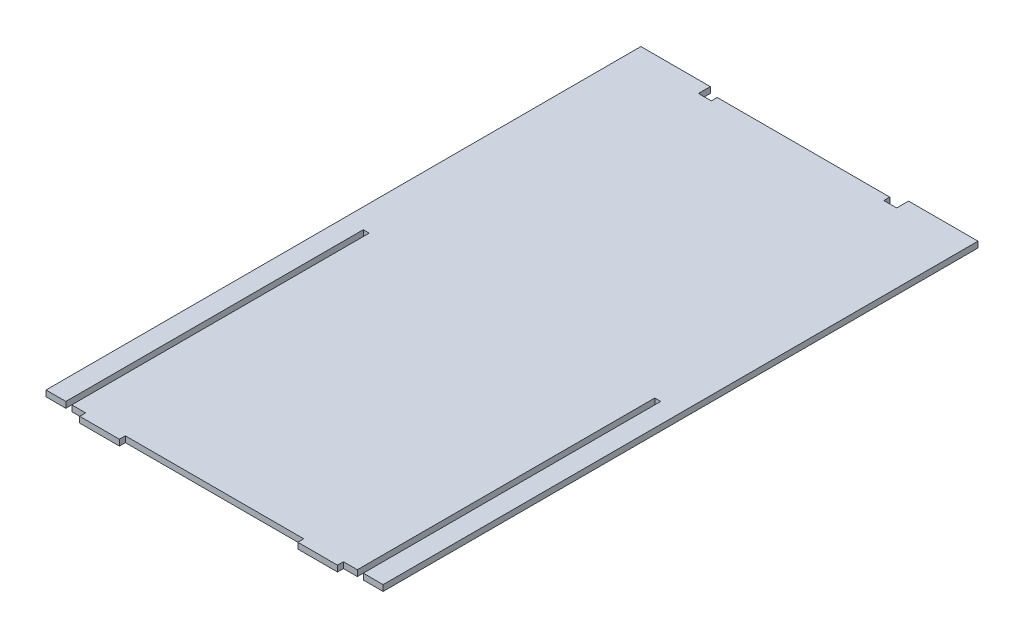
ISO-10303-21;
HEADER;
FILE_DESCRIPTION(('STEP AP214'),'2;1');
FILE_NAME('part.step','',(''),(''),'','','');
FILE_SCHEMA(('AUTOMOTIVE_DESIGN { 1 0 10303 214 1 1 1 1 }'));
ENDSEC;
DATA;
#1=APPLICATION_CONTEXT('core data for automotive mechanical design processes');
#2=APPLICATION_PROTOCOL_DEFINITION('international standard','automotive_design',2000,#1);
#3=PRODUCT_CONTEXT('',#1,'mechanical');
#4=PRODUCT('Part','Part','',(#3));
#5=PRODUCT_RELATED_PRODUCT_CATEGORY('part','',(#4));
#6=PRODUCT_DEFINITION_FORMATION('','',#4);
#7=PRODUCT_DEFINITION_CONTEXT('part definition',#1,'design');
#8=PRODUCT_DEFINITION('design','',#6,#7);
#9=PRODUCT_DEFINITION_SHAPE('','',#8);
#10=(LENGTH_UNIT() NAMED_UNIT(*) SI_UNIT(.MILLI.,.METRE.));
#11=(NAMED_UNIT(*) PLANE_ANGLE_UNIT() SI_UNIT($,.RADIAN.));
#12=(NAMED_UNIT(*) SI_UNIT($,.STERADIAN.) SOLID_ANGLE_UNIT());
#13=UNCERTAINTY_MEASURE_WITH_UNIT(LENGTH_MEASURE(1.E-05),#10,'distance_accuracy_value','');
#14=(GEOMETRIC_REPRESENTATION_CONTEXT(3) GLOBAL_UNCERTAINTY_ASSIGNED_CONTEXT((#13)) GLOBAL_UNIT_ASSIGNED_CONTEXT((#10,
#11,#12)) REPRESENTATION_CONTEXT('',''));
#15=CARTESIAN_POINT('',(0.,0.,0.));
#16=DIRECTION('',(0.,0.,1.));
#17=DIRECTION('',(1.,0.,0.));
#18=AXIS2_PLACEMENT_3D('',#15,#16,#17);
#19=CARTESIAN_POINT('',(0.,6.,-600.));
#20=DIRECTION('',(0.,0.,1.));
#21=DIRECTION('',(1.,0.,0.));
#22=AXIS2_PLACEMENT_3D('',#19,#20,#21);
#23=PLANE('',#22);
#24=DIRECTION('',(-1.,0.,0.));
#25=VECTOR('',#24,1.);
#26=CARTESIAN_POINT('',(0.,6.,-600.));
#27=LINE('',#26,#25);
#28=CARTESIAN_POINT('',(70.,6.,-600.));
#29=VERTEX_POINT('',#28);
#30=CARTESIAN_POINT('',(0.,6.,-600.));
#31=VERTEX_POINT('',#30);
#32=EDGE_CURVE('E366',#29,#31,#27,.T.);
#33=ORIENTED_EDGE('',*,*,#32,.F.);
#34=DIRECTION('',(0.,1.,0.));
#35=VECTOR('',#34,1.);
#36=CARTESIAN_POINT('',(70.,0.,-600.));
#37=LINE('',#36,#35);
#38=CARTESIAN_POINT('',(70.,0.,-600.));
#39=VERTEX_POINT('',#38);
#40=EDGE_CURVE('E282',#39,#29,#37,.T.);
#41=ORIENTED_EDGE('',*,*,#40,.F.);
#42=DIRECTION('',(-1.,0.,0.));
#43=VECTOR('',#42,1.);
#44=CARTESIAN_POINT('',(0.,0.,-600.));
#45=LINE('',#44,#43);
#46=CARTESIAN_POINT('',(0.,0.,-600.));
#47=VERTEX_POINT('',#46);
#48=EDGE_CURVE('E396',#39,#47,#45,.T.);
#49=ORIENTED_EDGE('',*,*,#48,.T.);
#50=DIRECTION('',(0.,-1.,0.));
#51=VECTOR('',#50,1.);
#52=CARTESIAN_POINT('',(0.,6.,-600.));
#53=LINE('',#52,#51);
#54=EDGE_CURVE('E404',#31,#47,#53,.T.);
#55=ORIENTED_EDGE('',*,*,#54,.F.);
#56=EDGE_LOOP('',(#33,#41,#49,#55));
#57=FACE_BOUND('',#56,.T.);
#58=ADVANCED_FACE('F41',(#57),#23,.F.);
#59=CARTESIAN_POINT('',(300.,6.,-2.10463319099841E-13));
#60=DIRECTION('',(0.,0.,-1.));
#61=DIRECTION('',(-1.,0.,0.));
#62=AXIS2_PLACEMENT_3D('',#59,#60,#61);
#63=PLANE('',#62);
#64=DIRECTION('',(1.,0.,0.));
#65=VECTOR('',#64,1.);
#66=CARTESIAN_POINT('',(300.,0.,-2.10463319099841E-13));
#67=LINE('',#66,#65);
#68=CARTESIAN_POINT('',(300.,0.,-2.10463319099841E-13));
#69=VERTEX_POINT('',#68);
#70=CARTESIAN_POINT('',(314.,0.,-3.31505656259168E-13));
#71=VERTEX_POINT('',#70);
#72=EDGE_CURVE('E391',#69,#71,#67,.T.);
#73=ORIENTED_EDGE('',*,*,#72,.T.);
#74=DIRECTION('',(0.,1.,0.));
#75=VECTOR('',#74,1.);
#76=CARTESIAN_POINT('',(314.,0.,-3.31505656259168E-13));
#77=LINE('',#76,#75);
#78=CARTESIAN_POINT('',(314.,6.,-3.31505656259168E-13));
#79=VERTEX_POINT('',#78);
#80=EDGE_CURVE('E300',#71,#79,#77,.T.);
#81=ORIENTED_EDGE('',*,*,#80,.T.);
#82=DIRECTION('',(1.,0.,0.));
#83=VECTOR('',#82,1.);
#84=CARTESIAN_POINT('',(300.,6.,-2.10463319099841E-13));
#85=LINE('',#84,#83);
#86=CARTESIAN_POINT('',(300.,6.,-2.10463319099841E-13));
#87=VERTEX_POINT('',#86);
#88=EDGE_CURVE('E361',#87,#79,#85,.T.);
#89=ORIENTED_EDGE('',*,*,#88,.F.);
#90=DIRECTION('',(0.,-1.,0.));
#91=VECTOR('',#90,1.);
#92=CARTESIAN_POINT('',(300.,6.,-2.10463319099841E-13));
#93=LINE('',#92,#91);
#94=EDGE_CURVE('E413',#87,#69,#93,.T.);
#95=ORIENTED_EDGE('',*,*,#94,.T.);
#96=EDGE_LOOP('',(#73,#81,#89,#95));
#97=FACE_BOUND('',#96,.T.);
#98=ADVANCED_FACE('F503',(#97),#63,.F.);
#99=CARTESIAN_POINT('',(40.,6.,0.));
#100=DIRECTION('',(0.,0.,-1.));
#101=DIRECTION('',(-1.,0.,0.));
#102=AXIS2_PLACEMENT_3D('',#99,#100,#101);
#103=PLANE('',#102);
#104=DIRECTION('',(1.,0.,0.));
#105=VECTOR('',#104,1.);
#106=CARTESIAN_POINT('',(40.,0.,0.));
#107=LINE('',#106,#105);
#108=CARTESIAN_POINT('',(0.,0.,0.));
#109=VERTEX_POINT('',#108);
#110=CARTESIAN_POINT('',(20.,0.,0.));
#111=VERTEX_POINT('',#110);
#112=EDGE_CURVE('E373',#109,#111,#107,.T.);
#113=ORIENTED_EDGE('',*,*,#112,.T.);
#114=DIRECTION('',(0.,1.,0.));
#115=VECTOR('',#114,1.);
#116=CARTESIAN_POINT('',(20.,0.,0.));
#117=LINE('',#116,#115);
#118=CARTESIAN_POINT('',(20.,6.,0.));
#119=VERTEX_POINT('',#118);
#120=EDGE_CURVE('E326',#111,#119,#117,.T.);
#121=ORIENTED_EDGE('',*,*,#120,.T.);
#122=DIRECTION('',(1.,0.,0.));
#123=VECTOR('',#122,1.);
#124=CARTESIAN_POINT('',(40.,6.,0.));
#125=LINE('',#124,#123);
#126=CARTESIAN_POINT('',(0.,6.,0.));
#127=VERTEX_POINT('',#126);
#128=EDGE_CURVE('E342',#127,#119,#125,.T.);
#129=ORIENTED_EDGE('',*,*,#128,.F.);
#130=DIRECTION('',(0.,-1.,0.));
#131=VECTOR('',#130,1.);
#132=CARTESIAN_POINT('',(0.,6.,0.));
#133=LINE('',#132,#131);
#134=EDGE_CURVE('E372',#127,#109,#133,.T.);
#135=ORIENTED_EDGE('',*,*,#134,.T.);
#136=EDGE_LOOP('',(#113,#121,#129,#135));
#137=FACE_BOUND('',#136,.T.);
#138=ADVANCED_FACE('F476',(#137),#103,.F.);
#139=CARTESIAN_POINT('',(26.,6.,0.));
#140=VERTEX_POINT('',#139);
#141=CARTESIAN_POINT('',(40.,6.,0.));
#142=VERTEX_POINT('',#141);
#143=EDGE_CURVE('E346',#140,#142,#125,.T.);
#144=ORIENTED_EDGE('',*,*,#143,.F.);
#145=DIRECTION('',(0.,1.,0.));
#146=VECTOR('',#145,1.);
#147=CARTESIAN_POINT('',(26.,0.,0.));
#148=LINE('',#147,#146);
#149=CARTESIAN_POINT('',(26.,0.,0.));
#150=VERTEX_POINT('',#149);
#151=EDGE_CURVE('E338',#150,#140,#148,.T.);
#152=ORIENTED_EDGE('',*,*,#151,.F.);
#153=CARTESIAN_POINT('',(40.,0.,0.));
#154=VERTEX_POINT('',#153);
#155=EDGE_CURVE('E335',#150,#154,#107,.T.);
#156=ORIENTED_EDGE('',*,*,#155,.T.);
#157=DIRECTION('',(0.,-1.,0.));
#158=VECTOR('',#157,1.);
#159=CARTESIAN_POINT('',(40.,6.,0.));
#160=LINE('',#159,#158);
#161=EDGE_CURVE('E11',#142,#154,#160,.T.);
#162=ORIENTED_EDGE('',*,*,#161,.F.);
#163=EDGE_LOOP('',(#144,#152,#156,#162));
#164=FACE_BOUND('',#163,.T.);
#165=ADVANCED_FACE('F43',(#164),#103,.F.);
#166=CARTESIAN_POINT('',(40.,6.,0.));
#167=DIRECTION('',(1.,0.,0.));
#168=DIRECTION('',(0.,0.,-1.));
#169=AXIS2_PLACEMENT_3D('',#166,#167,#168);
#170=PLANE('',#169);
#171=DIRECTION('',(0.,0.,1.));
#172=VECTOR('',#171,1.);
#173=CARTESIAN_POINT('',(40.,0.,0.));
#174=LINE('',#173,#172);
#175=CARTESIAN_POINT('',(40.,0.,6.00000000000003));
#176=VERTEX_POINT('',#175);
#177=EDGE_CURVE('E376',#154,#176,#174,.T.);
#178=ORIENTED_EDGE('',*,*,#177,.T.);
#179=DIRECTION('',(0.,-1.,0.));
#180=VECTOR('',#179,1.);
#181=CARTESIAN_POINT('',(40.,6.,6.00000000000003));
#182=LINE('',#181,#180);
#183=CARTESIAN_POINT('',(40.,6.,6.00000000000003));
#184=VERTEX_POINT('',#183);
#185=EDGE_CURVE('E49',#184,#176,#182,.T.);
#186=ORIENTED_EDGE('',*,*,#185,.F.);
#187=DIRECTION('',(0.,0.,1.));
#188=VECTOR('',#187,1.);
#189=CARTESIAN_POINT('',(40.,6.,0.));
#190=LINE('',#189,#188);
#191=EDGE_CURVE('E345',#142,#184,#190,.T.);
#192=ORIENTED_EDGE('',*,*,#191,.F.);
#193=ORIENTED_EDGE('',*,*,#161,.T.);
#194=EDGE_LOOP('',(#178,#186,#192,#193));
#195=FACE_BOUND('',#194,.T.);
#196=ADVANCED_FACE('F460',(#195),#170,.F.);
#197=CARTESIAN_POINT('',(40.,6.,6.00000000000003));
#198=DIRECTION('',(0.,0.,-1.));
#199=DIRECTION('',(-1.,0.,0.));
#200=AXIS2_PLACEMENT_3D('',#197,#198,#199);
#201=PLANE('',#200);
#202=DIRECTION('',(1.,0.,0.));
#203=VECTOR('',#202,1.);
#204=CARTESIAN_POINT('',(40.,0.,6.00000000000003));
#205=LINE('',#204,#203);
#206=CARTESIAN_POINT('',(80.,0.,5.99999999999993));
#207=VERTEX_POINT('',#206);
#208=EDGE_CURVE('E378',#176,#207,#205,.T.);
#209=ORIENTED_EDGE('',*,*,#208,.T.);
#210=DIRECTION('',(0.,-1.,0.));
#211=VECTOR('',#210,1.);
#212=CARTESIAN_POINT('',(80.,6.,5.99999999999993));
#213=LINE('',#212,#211);
#214=CARTESIAN_POINT('',(80.,6.,5.99999999999993));
#215=VERTEX_POINT('',#214);
#216=EDGE_CURVE('E428',#215,#207,#213,.T.);
#217=ORIENTED_EDGE('',*,*,#216,.F.);
#218=DIRECTION('',(1.,0.,0.));
#219=VECTOR('',#218,1.);
#220=CARTESIAN_POINT('',(40.,6.,6.00000000000003));
#221=LINE('',#220,#219);
#222=EDGE_CURVE('E348',#184,#215,#221,.T.);
#223=ORIENTED_EDGE('',*,*,#222,.F.);
#224=ORIENTED_EDGE('',*,*,#185,.T.);
#225=EDGE_LOOP('',(#209,#217,#223,#224));
#226=FACE_BOUND('',#225,.T.);
#227=ADVANCED_FACE('F435',(#226),#201,.F.);
#228=CARTESIAN_POINT('',(80.,6.,5.99999999999993));
#229=DIRECTION('',(-1.,0.,0.));
#230=DIRECTION('',(0.,0.,1.));
#231=AXIS2_PLACEMENT_3D('',#228,#229,#230);
#232=PLANE('',#231);
#233=DIRECTION('',(0.,0.,-1.));
#234=VECTOR('',#233,1.);
#235=CARTESIAN_POINT('',(80.,0.,5.99999999999993));
#236=LINE('',#235,#234);
#237=CARTESIAN_POINT('',(80.,0.,0.));
#238=VERTEX_POINT('',#237);
#239=EDGE_CURVE('E380',#207,#238,#236,.T.);
#240=ORIENTED_EDGE('',*,*,#239,.T.);
#241=DIRECTION('',(0.,-1.,0.));
#242=VECTOR('',#241,1.);
#243=CARTESIAN_POINT('',(80.,6.,0.));
#244=LINE('',#243,#242);
#245=CARTESIAN_POINT('',(80.,6.,0.));
#246=VERTEX_POINT('',#245);
#247=EDGE_CURVE('E425',#246,#238,#244,.T.);
#248=ORIENTED_EDGE('',*,*,#247,.F.);
#249=DIRECTION('',(0.,0.,-1.));
#250=VECTOR('',#249,1.);
#251=CARTESIAN_POINT('',(80.,6.,5.99999999999993));
#252=LINE('',#251,#250);
#253=EDGE_CURVE('E350',#215,#246,#252,.T.);
#254=ORIENTED_EDGE('',*,*,#253,.F.);
#255=ORIENTED_EDGE('',*,*,#216,.T.);
#256=EDGE_LOOP('',(#240,#248,#254,#255));
#257=FACE_BOUND('',#256,.T.);
#258=ADVANCED_FACE('F446',(#257),#232,.F.);
#259=CARTESIAN_POINT('',(80.,6.,0.));
#260=DIRECTION('',(0.,0.,-1.));
#261=DIRECTION('',(-1.,0.,0.));
#262=AXIS2_PLACEMENT_3D('',#259,#260,#261);
#263=PLANE('',#262);
#264=DIRECTION('',(1.,0.,0.));
#265=VECTOR('',#264,1.);
#266=CARTESIAN_POINT('',(80.,0.,0.));
#267=LINE('',#266,#265);
#268=CARTESIAN_POINT('',(260.,0.,-1.85615411929518E-13));
#269=VERTEX_POINT('',#268);
#270=EDGE_CURVE('E382',#238,#269,#267,.T.);
#271=ORIENTED_EDGE('',*,*,#270,.T.);
#272=DIRECTION('',(0.,-1.,0.));
#273=VECTOR('',#272,1.);
#274=CARTESIAN_POINT('',(260.,6.,-1.85615411929518E-13));
#275=LINE('',#274,#273);
#276=CARTESIAN_POINT('',(260.,6.,-1.85615411929518E-13));
#277=VERTEX_POINT('',#276);
#278=EDGE_CURVE('E422',#277,#269,#275,.T.);
#279=ORIENTED_EDGE('',*,*,#278,.F.);
#280=DIRECTION('',(1.,0.,0.));
#281=VECTOR('',#280,1.);
#282=CARTESIAN_POINT('',(80.,6.,0.));
#283=LINE('',#282,#281);
#284=EDGE_CURVE('E352',#246,#277,#283,.T.);
#285=ORIENTED_EDGE('',*,*,#284,.F.);
#286=ORIENTED_EDGE('',*,*,#247,.T.);
#287=EDGE_LOOP('',(#271,#279,#285,#286));
#288=FACE_BOUND('',#287,.T.);
#289=ADVANCED_FACE('F450',(#288),#263,.F.);
#290=CARTESIAN_POINT('',(260.,6.,5.99999999999979));
#291=DIRECTION('',(1.,0.,0.));
#292=DIRECTION('',(0.,0.,-1.));
#293=AXIS2_PLACEMENT_3D('',#290,#291,#292);
#294=PLANE('',#293);
#295=DIRECTION('',(0.,0.,1.));
#296=VECTOR('',#295,1.);
#297=CARTESIAN_POINT('',(260.,0.,5.99999999999979));
#298=LINE('',#297,#296);
#299=CARTESIAN_POINT('',(260.,0.,5.99999999999979));
#300=VERTEX_POINT('',#299);
#301=EDGE_CURVE('E384',#269,#300,#298,.T.);
#302=ORIENTED_EDGE('',*,*,#301,.T.);
#303=DIRECTION('',(0.,-1.,0.));
#304=VECTOR('',#303,1.);
#305=CARTESIAN_POINT('',(260.,6.,5.99999999999979));
#306=LINE('',#305,#304);
#307=CARTESIAN_POINT('',(260.,6.,5.99999999999979));
#308=VERTEX_POINT('',#307);
#309=EDGE_CURVE('E419',#308,#300,#306,.T.);
#310=ORIENTED_EDGE('',*,*,#309,.F.);
#311=DIRECTION('',(0.,0.,1.));
#312=VECTOR('',#311,1.);
#313=CARTESIAN_POINT('',(260.,6.,5.99999999999979));
#314=LINE('',#313,#312);
#315=EDGE_CURVE('E354',#277,#308,#314,.T.);
#316=ORIENTED_EDGE('',*,*,#315,.F.);
#317=ORIENTED_EDGE('',*,*,#278,.T.);
#318=EDGE_LOOP('',(#302,#310,#316,#317));
#319=FACE_BOUND('',#318,.T.);
#320=ADVANCED_FACE('F561',(#319),#294,.F.);
#321=CARTESIAN_POINT('',(300.,6.,5.99999999999979));
#322=DIRECTION('',(0.,0.,-1.));
#323=DIRECTION('',(-1.,0.,0.));
#324=AXIS2_PLACEMENT_3D('',#321,#322,#323);
#325=PLANE('',#324);
#326=DIRECTION('',(1.,0.,0.));
#327=VECTOR('',#326,1.);
#328=CARTESIAN_POINT('',(300.,0.,5.99999999999979));
#329=LINE('',#328,#327);
#330=CARTESIAN_POINT('',(300.,0.,5.99999999999979));
#331=VERTEX_POINT('',#330);
#332=EDGE_CURVE('E386',#300,#331,#329,.T.);
#333=ORIENTED_EDGE('',*,*,#332,.T.);
#334=DIRECTION('',(0.,-1.,0.));
#335=VECTOR('',#334,1.);
#336=CARTESIAN_POINT('',(300.,6.,5.99999999999979));
#337=LINE('',#336,#335);
#338=CARTESIAN_POINT('',(300.,6.,5.99999999999979));
#339=VERTEX_POINT('',#338);
#340=EDGE_CURVE('E416',#339,#331,#337,.T.);
#341=ORIENTED_EDGE('',*,*,#340,.F.);
#342=DIRECTION('',(1.,0.,0.));
#343=VECTOR('',#342,1.);
#344=CARTESIAN_POINT('',(300.,6.,5.99999999999979));
#345=LINE('',#344,#343);
#346=EDGE_CURVE('E356',#308,#339,#345,.T.);
#347=ORIENTED_EDGE('',*,*,#346,.F.);
#348=ORIENTED_EDGE('',*,*,#309,.T.);
#349=EDGE_LOOP('',(#333,#341,#347,#348));
#350=FACE_BOUND('',#349,.T.);
#351=ADVANCED_FACE('F559',(#350),#325,.F.);
#352=CARTESIAN_POINT('',(300.,6.,-2.10463319099841E-13));
#353=DIRECTION('',(-1.,0.,0.));
#354=DIRECTION('',(0.,0.,1.));
#355=AXIS2_PLACEMENT_3D('',#352,#353,#354);
#356=PLANE('',#355);
#357=DIRECTION('',(0.,0.,-1.));
#358=VECTOR('',#357,1.);
#359=CARTESIAN_POINT('',(300.,0.,-2.10463319099841E-13));
#360=LINE('',#359,#358);
#361=EDGE_CURVE('E388',#331,#69,#360,.T.);
#362=ORIENTED_EDGE('',*,*,#361,.T.);
#363=ORIENTED_EDGE('',*,*,#94,.F.);
#364=DIRECTION('',(0.,0.,-1.));
#365=VECTOR('',#364,1.);
#366=CARTESIAN_POINT('',(300.,6.,-2.10463319099841E-13));
#367=LINE('',#366,#365);
#368=EDGE_CURVE('E358',#339,#87,#367,.T.);
#369=ORIENTED_EDGE('',*,*,#368,.F.);
#370=ORIENTED_EDGE('',*,*,#340,.T.);
#371=EDGE_LOOP('',(#362,#363,#369,#370));
#372=FACE_BOUND('',#371,.T.);
#373=ADVANCED_FACE('F554',(#372),#356,.F.);
#374=CARTESIAN_POINT('',(320.,6.,-3.31505656259168E-13));
#375=VERTEX_POINT('',#374);
#376=CARTESIAN_POINT('',(340.,6.,0.));
#377=VERTEX_POINT('',#376);
#378=EDGE_CURVE('E360',#375,#377,#85,.T.);
#379=ORIENTED_EDGE('',*,*,#378,.F.);
#380=DIRECTION('',(0.,1.,0.));
#381=VECTOR('',#380,1.);
#382=CARTESIAN_POINT('',(320.,0.,-3.31505656259168E-13));
#383=LINE('',#382,#381);
#384=CARTESIAN_POINT('',(320.,0.,-3.31505656259168E-13));
#385=VERTEX_POINT('',#384);
#386=EDGE_CURVE('E312',#385,#375,#383,.T.);
#387=ORIENTED_EDGE('',*,*,#386,.F.);
#388=CARTESIAN_POINT('',(340.,0.,0.));
#389=VERTEX_POINT('',#388);
#390=EDGE_CURVE('E390',#385,#389,#67,.T.);
#391=ORIENTED_EDGE('',*,*,#390,.T.);
#392=DIRECTION('',(0.,-1.,0.));
#393=VECTOR('',#392,1.);
#394=CARTESIAN_POINT('',(340.,6.,0.));
#395=LINE('',#394,#393);
#396=EDGE_CURVE('E410',#377,#389,#395,.T.);
#397=ORIENTED_EDGE('',*,*,#396,.F.);
#398=EDGE_LOOP('',(#379,#387,#391,#397));
#399=FACE_BOUND('',#398,.T.);
#400=ADVANCED_FACE('F513',(#399),#63,.F.);
#401=CARTESIAN_POINT('',(340.,6.,0.));
#402=DIRECTION('',(-1.,0.,0.));
#403=DIRECTION('',(0.,0.,1.));
#404=AXIS2_PLACEMENT_3D('',#401,#402,#403);
#405=PLANE('',#404);
#406=DIRECTION('',(0.,0.,-1.));
#407=VECTOR('',#406,1.);
#408=CARTESIAN_POINT('',(340.,0.,0.));
#409=LINE('',#408,#407);
#410=CARTESIAN_POINT('',(340.,0.,-600.));
#411=VERTEX_POINT('',#410);
#412=EDGE_CURVE('E394',#389,#411,#409,.T.);
#413=ORIENTED_EDGE('',*,*,#412,.T.);
#414=DIRECTION('',(0.,-1.,0.));
#415=VECTOR('',#414,1.);
#416=CARTESIAN_POINT('',(340.,6.,-600.));
#417=LINE('',#416,#415);
#418=CARTESIAN_POINT('',(340.,6.,-600.));
#419=VERTEX_POINT('',#418);
#420=EDGE_CURVE('E407',#419,#411,#417,.T.);
#421=ORIENTED_EDGE('',*,*,#420,.F.);
#422=DIRECTION('',(0.,0.,-1.));
#423=VECTOR('',#422,1.);
#424=CARTESIAN_POINT('',(340.,6.,0.));
#425=LINE('',#424,#423);
#426=EDGE_CURVE('E364',#377,#419,#425,.T.);
#427=ORIENTED_EDGE('',*,*,#426,.F.);
#428=ORIENTED_EDGE('',*,*,#396,.T.);
#429=EDGE_LOOP('',(#413,#421,#427,#428));
#430=FACE_BOUND('',#429,.T.);
#431=ADVANCED_FACE('F516',(#430),#405,.F.);
#432=CARTESIAN_POINT('',(270.,0.,-600.));
#433=VERTEX_POINT('',#432);
#434=EDGE_CURVE('E397',#411,#433,#45,.T.);
#435=ORIENTED_EDGE('',*,*,#434,.T.);
#436=DIRECTION('',(0.,1.,0.));
#437=VECTOR('',#436,1.);
#438=CARTESIAN_POINT('',(270.,0.,-600.));
#439=LINE('',#438,#437);
#440=CARTESIAN_POINT('',(270.,6.,-600.));
#441=VERTEX_POINT('',#440);
#442=EDGE_CURVE('E284',#433,#441,#439,.T.);
#443=ORIENTED_EDGE('',*,*,#442,.T.);
#444=EDGE_CURVE('E367',#419,#441,#27,.T.);
#445=ORIENTED_EDGE('',*,*,#444,.F.);
#446=ORIENTED_EDGE('',*,*,#420,.T.);
#447=EDGE_LOOP('',(#435,#443,#445,#446));
#448=FACE_BOUND('',#447,.T.);
#449=ADVANCED_FACE('F505',(#448),#23,.F.);
#450=CARTESIAN_POINT('',(0.,6.,0.));
#451=DIRECTION('',(1.,0.,0.));
#452=DIRECTION('',(0.,0.,-1.));
#453=AXIS2_PLACEMENT_3D('',#450,#451,#452);
#454=PLANE('',#453);
#455=DIRECTION('',(0.,0.,1.));
#456=VECTOR('',#455,1.);
#457=CARTESIAN_POINT('',(0.,0.,0.));
#458=LINE('',#457,#456);
#459=EDGE_CURVE('E400',#47,#109,#458,.T.);
#460=ORIENTED_EDGE('',*,*,#459,.T.);
#461=ORIENTED_EDGE('',*,*,#134,.F.);
#462=DIRECTION('',(0.,0.,1.));
#463=VECTOR('',#462,1.);
#464=CARTESIAN_POINT('',(0.,6.,0.));
#465=LINE('',#464,#463);
#466=EDGE_CURVE('E370',#31,#127,#465,.T.);
#467=ORIENTED_EDGE('',*,*,#466,.F.);
#468=ORIENTED_EDGE('',*,*,#54,.T.);
#469=EDGE_LOOP('',(#460,#461,#467,#468));
#470=FACE_BOUND('',#469,.T.);
#471=ADVANCED_FACE('F481',(#470),#454,.F.);
#472=CARTESIAN_POINT('',(0.,6.,0.));
#473=DIRECTION('',(0.,-1.,0.));
#474=DIRECTION('',(0.,0.,-1.));
#475=AXIS2_PLACEMENT_3D('',#472,#473,#474);
#476=PLANE('',#475);
#477=DIRECTION('',(1.,0.,0.));
#478=VECTOR('',#477,1.);
#479=CARTESIAN_POINT('',(70.,6.,-588.));
#480=LINE('',#479,#478);
#481=CARTESIAN_POINT('',(70.,6.,-588.));
#482=VERTEX_POINT('',#481);
#483=CARTESIAN_POINT('',(83.,6.,-588.));
#484=VERTEX_POINT('',#483);
#485=EDGE_CURVE('E248',#482,#484,#480,.T.);
#486=ORIENTED_EDGE('',*,*,#485,.F.);
#487=DIRECTION('',(0.,0.,1.));
#488=VECTOR('',#487,1.);
#489=CARTESIAN_POINT('',(70.,6.,-600.));
#490=LINE('',#489,#488);
#491=EDGE_CURVE('E251',#29,#482,#490,.T.);
#492=ORIENTED_EDGE('',*,*,#491,.F.);
#493=ORIENTED_EDGE('',*,*,#32,.T.);
#494=ORIENTED_EDGE('',*,*,#466,.T.);
#495=ORIENTED_EDGE('',*,*,#128,.T.);
#496=DIRECTION('',(0.,0.,1.));
#497=VECTOR('',#496,1.);
#498=CARTESIAN_POINT('',(20.,6.,0.));
#499=LINE('',#498,#497);
#500=CARTESIAN_POINT('',(20.,6.,-300.));
#501=VERTEX_POINT('',#500);
#502=EDGE_CURVE('E309',#501,#119,#499,.T.);
#503=ORIENTED_EDGE('',*,*,#502,.F.);
#504=DIRECTION('',(-1.,0.,0.));
#505=VECTOR('',#504,1.);
#506=CARTESIAN_POINT('',(20.,6.,-300.));
#507=LINE('',#506,#505);
#508=CARTESIAN_POINT('',(26.,6.,-300.));
#509=VERTEX_POINT('',#508);
#510=EDGE_CURVE('E320',#509,#501,#507,.T.);
#511=ORIENTED_EDGE('',*,*,#510,.F.);
#512=DIRECTION('',(0.,0.,-1.));
#513=VECTOR('',#512,1.);
#514=CARTESIAN_POINT('',(26.,6.,0.));
#515=LINE('',#514,#513);
#516=EDGE_CURVE('E328',#140,#509,#515,.T.);
#517=ORIENTED_EDGE('',*,*,#516,.F.);
#518=ORIENTED_EDGE('',*,*,#143,.T.);
#519=ORIENTED_EDGE('',*,*,#191,.T.);
#520=ORIENTED_EDGE('',*,*,#222,.T.);
#521=ORIENTED_EDGE('',*,*,#253,.T.);
#522=ORIENTED_EDGE('',*,*,#284,.T.);
#523=ORIENTED_EDGE('',*,*,#315,.T.);
#524=ORIENTED_EDGE('',*,*,#346,.T.);
#525=ORIENTED_EDGE('',*,*,#368,.T.);
#526=ORIENTED_EDGE('',*,*,#88,.T.);
#527=DIRECTION('',(0.,0.,1.));
#528=VECTOR('',#527,1.);
#529=CARTESIAN_POINT('',(314.,6.,-3.31505656259168E-13));
#530=LINE('',#529,#528);
#531=CARTESIAN_POINT('',(314.,6.,-300.));
#532=VERTEX_POINT('',#531);
#533=EDGE_CURVE('E279',#532,#79,#530,.T.);
#534=ORIENTED_EDGE('',*,*,#533,.F.);
#535=DIRECTION('',(-1.,0.,0.));
#536=VECTOR('',#535,1.);
#537=CARTESIAN_POINT('',(314.,6.,-300.));
#538=LINE('',#537,#536);
#539=CARTESIAN_POINT('',(320.,6.,-300.));
#540=VERTEX_POINT('',#539);
#541=EDGE_CURVE('E296',#540,#532,#538,.T.);
#542=ORIENTED_EDGE('',*,*,#541,.F.);
#543=DIRECTION('',(0.,0.,-1.));
#544=VECTOR('',#543,1.);
#545=CARTESIAN_POINT('',(320.,6.,-3.31505656259168E-13));
#546=LINE('',#545,#544);
#547=EDGE_CURVE('E302',#375,#540,#546,.T.);
#548=ORIENTED_EDGE('',*,*,#547,.F.);
#549=ORIENTED_EDGE('',*,*,#378,.T.);
#550=ORIENTED_EDGE('',*,*,#426,.T.);
#551=ORIENTED_EDGE('',*,*,#444,.T.);
#552=DIRECTION('',(0.,0.,-1.));
#553=VECTOR('',#552,1.);
#554=CARTESIAN_POINT('',(270.,6.,-600.));
#555=LINE('',#554,#553);
#556=CARTESIAN_POINT('',(270.,6.,-588.));
#557=VERTEX_POINT('',#556);
#558=EDGE_CURVE('E273',#557,#441,#555,.T.);
#559=ORIENTED_EDGE('',*,*,#558,.F.);
#560=DIRECTION('',(1.,0.,0.));
#561=VECTOR('',#560,1.);
#562=CARTESIAN_POINT('',(270.,6.,-588.));
#563=LINE('',#562,#561);
#564=CARTESIAN_POINT('',(257.,6.,-588.));
#565=VERTEX_POINT('',#564);
#566=EDGE_CURVE('E270',#565,#557,#563,.T.);
#567=ORIENTED_EDGE('',*,*,#566,.F.);
#568=DIRECTION('',(0.,0.,1.));
#569=VECTOR('',#568,1.);
#570=CARTESIAN_POINT('',(257.,6.,-588.));
#571=LINE('',#570,#569);
#572=CARTESIAN_POINT('',(257.,6.,-594.));
#573=VERTEX_POINT('',#572);
#574=EDGE_CURVE('E267',#573,#565,#571,.T.);
#575=ORIENTED_EDGE('',*,*,#574,.F.);
#576=DIRECTION('',(1.,0.,0.));
#577=VECTOR('',#576,1.);
#578=CARTESIAN_POINT('',(83.,6.,-594.));
#579=LINE('',#578,#577);
#580=CARTESIAN_POINT('',(83.,6.,-594.));
#581=VERTEX_POINT('',#580);
#582=EDGE_CURVE('E265',#581,#573,#579,.T.);
#583=ORIENTED_EDGE('',*,*,#582,.F.);
#584=DIRECTION('',(0.,0.,-1.));
#585=VECTOR('',#584,1.);
#586=CARTESIAN_POINT('',(83.,6.,-588.));
#587=LINE('',#586,#585);
#588=EDGE_CURVE('E233',#484,#581,#587,.T.);
#589=ORIENTED_EDGE('',*,*,#588,.F.);
#590=EDGE_LOOP('',(#486,#492,#493,#494,#495,#503,#511,#517,#518,#519,#520,#521,#522,#523,#524,
#525,#526,#534,#542,#548,#549,#550,#551,#559,#567,#575,#583,#589));
#591=FACE_BOUND('',#590,.T.);
#592=ADVANCED_FACE('F455',(#591),#476,.F.);
#593=CARTESIAN_POINT('',(0.,0.,0.));
#594=DIRECTION('',(0.,-1.,0.));
#595=DIRECTION('',(0.,0.,-1.));
#596=AXIS2_PLACEMENT_3D('',#593,#594,#595);
#597=PLANE('',#596);
#598=DIRECTION('',(0.,0.,1.));
#599=VECTOR('',#598,1.);
#600=CARTESIAN_POINT('',(70.,0.,-600.));
#601=LINE('',#600,#599);
#602=CARTESIAN_POINT('',(70.,0.,-588.));
#603=VERTEX_POINT('',#602);
#604=EDGE_CURVE('E261',#39,#603,#601,.T.);
#605=ORIENTED_EDGE('',*,*,#604,.T.);
#606=DIRECTION('',(1.,0.,0.));
#607=VECTOR('',#606,1.);
#608=CARTESIAN_POINT('',(70.,0.,-588.));
#609=LINE('',#608,#607);
#610=CARTESIAN_POINT('',(83.,0.,-588.));
#611=VERTEX_POINT('',#610);
#612=EDGE_CURVE('E238',#603,#611,#609,.T.);
#613=ORIENTED_EDGE('',*,*,#612,.T.);
#614=DIRECTION('',(0.,0.,-1.));
#615=VECTOR('',#614,1.);
#616=CARTESIAN_POINT('',(83.,0.,-588.));
#617=LINE('',#616,#615);
#618=CARTESIAN_POINT('',(83.,0.,-594.));
#619=VERTEX_POINT('',#618);
#620=EDGE_CURVE('E230',#611,#619,#617,.T.);
#621=ORIENTED_EDGE('',*,*,#620,.T.);
#622=DIRECTION('',(1.,0.,0.));
#623=VECTOR('',#622,1.);
#624=CARTESIAN_POINT('',(83.,0.,-594.));
#625=LINE('',#624,#623);
#626=CARTESIAN_POINT('',(257.,0.,-594.));
#627=VERTEX_POINT('',#626);
#628=EDGE_CURVE('E241',#619,#627,#625,.T.);
#629=ORIENTED_EDGE('',*,*,#628,.T.);
#630=DIRECTION('',(0.,0.,1.));
#631=VECTOR('',#630,1.);
#632=CARTESIAN_POINT('',(257.,0.,-588.));
#633=LINE('',#632,#631);
#634=CARTESIAN_POINT('',(257.,0.,-588.));
#635=VERTEX_POINT('',#634);
#636=EDGE_CURVE('E56',#627,#635,#633,.T.);
#637=ORIENTED_EDGE('',*,*,#636,.T.);
#638=DIRECTION('',(1.,0.,0.));
#639=VECTOR('',#638,1.);
#640=CARTESIAN_POINT('',(270.,0.,-588.));
#641=LINE('',#640,#639);
#642=CARTESIAN_POINT('',(270.,0.,-588.));
#643=VERTEX_POINT('',#642);
#644=EDGE_CURVE('E255',#635,#643,#641,.T.);
#645=ORIENTED_EDGE('',*,*,#644,.T.);
#646=DIRECTION('',(0.,0.,-1.));
#647=VECTOR('',#646,1.);
#648=CARTESIAN_POINT('',(270.,0.,-600.));
#649=LINE('',#648,#647);
#650=EDGE_CURVE('E258',#643,#433,#649,.T.);
#651=ORIENTED_EDGE('',*,*,#650,.T.);
#652=ORIENTED_EDGE('',*,*,#434,.F.);
#653=ORIENTED_EDGE('',*,*,#412,.F.);
#654=ORIENTED_EDGE('',*,*,#390,.F.);
#655=DIRECTION('',(0.,0.,-1.));
#656=VECTOR('',#655,1.);
#657=CARTESIAN_POINT('',(320.,0.,-3.31505656259168E-13));
#658=LINE('',#657,#656);
#659=CARTESIAN_POINT('',(320.,0.,-300.));
#660=VERTEX_POINT('',#659);
#661=EDGE_CURVE('E295',#385,#660,#658,.T.);
#662=ORIENTED_EDGE('',*,*,#661,.T.);
#663=DIRECTION('',(-1.,0.,0.));
#664=VECTOR('',#663,1.);
#665=CARTESIAN_POINT('',(314.,0.,-300.));
#666=LINE('',#665,#664);
#667=CARTESIAN_POINT('',(314.,0.,-300.));
#668=VERTEX_POINT('',#667);
#669=EDGE_CURVE('E64',#660,#668,#666,.T.);
#670=ORIENTED_EDGE('',*,*,#669,.T.);
#671=DIRECTION('',(0.,0.,1.));
#672=VECTOR('',#671,1.);
#673=CARTESIAN_POINT('',(314.,0.,-3.31505656259168E-13));
#674=LINE('',#673,#672);
#675=EDGE_CURVE('E292',#668,#71,#674,.T.);
#676=ORIENTED_EDGE('',*,*,#675,.T.);
#677=ORIENTED_EDGE('',*,*,#72,.F.);
#678=ORIENTED_EDGE('',*,*,#361,.F.);
#679=ORIENTED_EDGE('',*,*,#332,.F.);
#680=ORIENTED_EDGE('',*,*,#301,.F.);
#681=ORIENTED_EDGE('',*,*,#270,.F.);
#682=ORIENTED_EDGE('',*,*,#239,.F.);
#683=ORIENTED_EDGE('',*,*,#208,.F.);
#684=ORIENTED_EDGE('',*,*,#177,.F.);
#685=ORIENTED_EDGE('',*,*,#155,.F.);
#686=DIRECTION('',(0.,0.,-1.));
#687=VECTOR('',#686,1.);
#688=CARTESIAN_POINT('',(26.,0.,0.));
#689=LINE('',#688,#687);
#690=CARTESIAN_POINT('',(26.,0.,-300.));
#691=VERTEX_POINT('',#690);
#692=EDGE_CURVE('E319',#150,#691,#689,.T.);
#693=ORIENTED_EDGE('',*,*,#692,.T.);
#694=DIRECTION('',(-1.,0.,0.));
#695=VECTOR('',#694,1.);
#696=CARTESIAN_POINT('',(20.,0.,-300.));
#697=LINE('',#696,#695);
#698=CARTESIAN_POINT('',(20.,0.,-300.));
#699=VERTEX_POINT('',#698);
#700=EDGE_CURVE('E323',#691,#699,#697,.T.);
#701=ORIENTED_EDGE('',*,*,#700,.T.);
#702=DIRECTION('',(0.,0.,1.));
#703=VECTOR('',#702,1.);
#704=CARTESIAN_POINT('',(20.,0.,0.));
#705=LINE('',#704,#703);
#706=EDGE_CURVE('E316',#699,#111,#705,.T.);
#707=ORIENTED_EDGE('',*,*,#706,.T.);
#708=ORIENTED_EDGE('',*,*,#112,.F.);
#709=ORIENTED_EDGE('',*,*,#459,.F.);
#710=ORIENTED_EDGE('',*,*,#48,.F.);
#711=EDGE_LOOP('',(#605,#613,#621,#629,#637,#645,#651,#652,#653,#654,#662,#670,#676,#677,#678,
#679,#680,#681,#682,#683,#684,#685,#693,#701,#707,#708,#709,#710));
#712=FACE_BOUND('',#711,.T.);
#713=ADVANCED_FACE('F246',(#712),#597,.T.);
#714=CARTESIAN_POINT('',(20.,0.,0.));
#715=DIRECTION('',(-1.,0.,0.));
#716=DIRECTION('',(0.,0.,1.));
#717=AXIS2_PLACEMENT_3D('',#714,#715,#716);
#718=PLANE('',#717);
#719=ORIENTED_EDGE('',*,*,#502,.T.);
#720=ORIENTED_EDGE('',*,*,#120,.F.);
#721=ORIENTED_EDGE('',*,*,#706,.F.);
#722=DIRECTION('',(0.,1.,0.));
#723=VECTOR('',#722,1.);
#724=CARTESIAN_POINT('',(20.,0.,-300.));
#725=LINE('',#724,#723);
#726=EDGE_CURVE('E333',#699,#501,#725,.T.);
#727=ORIENTED_EDGE('',*,*,#726,.T.);
#728=EDGE_LOOP('',(#719,#720,#721,#727));
#729=FACE_BOUND('',#728,.T.);
#730=ADVANCED_FACE('F472',(#729),#718,.F.);
#731=CARTESIAN_POINT('',(20.,0.,-300.));
#732=DIRECTION('',(0.,0.,-1.));
#733=DIRECTION('',(-1.,0.,0.));
#734=AXIS2_PLACEMENT_3D('',#731,#732,#733);
#735=PLANE('',#734);
#736=ORIENTED_EDGE('',*,*,#510,.T.);
#737=ORIENTED_EDGE('',*,*,#726,.F.);
#738=ORIENTED_EDGE('',*,*,#700,.F.);
#739=DIRECTION('',(0.,1.,0.));
#740=VECTOR('',#739,1.);
#741=CARTESIAN_POINT('',(26.,0.,-300.));
#742=LINE('',#741,#740);
#743=EDGE_CURVE('E336',#691,#509,#742,.T.);
#744=ORIENTED_EDGE('',*,*,#743,.T.);
#745=EDGE_LOOP('',(#736,#737,#738,#744));
#746=FACE_BOUND('',#745,.T.);
#747=ADVANCED_FACE('F468',(#746),#735,.F.);
#748=CARTESIAN_POINT('',(26.,0.,0.));
#749=DIRECTION('',(1.,0.,0.));
#750=DIRECTION('',(0.,0.,-1.));
#751=AXIS2_PLACEMENT_3D('',#748,#749,#750);
#752=PLANE('',#751);
#753=ORIENTED_EDGE('',*,*,#516,.T.);
#754=ORIENTED_EDGE('',*,*,#743,.F.);
#755=ORIENTED_EDGE('',*,*,#692,.F.);
#756=ORIENTED_EDGE('',*,*,#151,.T.);
#757=EDGE_LOOP('',(#753,#754,#755,#756));
#758=FACE_BOUND('',#757,.T.);
#759=ADVANCED_FACE('F465',(#758),#752,.F.);
#760=CARTESIAN_POINT('',(314.,0.,-3.31505656259168E-13));
#761=DIRECTION('',(-1.,0.,0.));
#762=DIRECTION('',(0.,0.,1.));
#763=AXIS2_PLACEMENT_3D('',#760,#761,#762);
#764=PLANE('',#763);
#765=ORIENTED_EDGE('',*,*,#533,.T.);
#766=ORIENTED_EDGE('',*,*,#80,.F.);
#767=ORIENTED_EDGE('',*,*,#675,.F.);
#768=DIRECTION('',(0.,1.,0.));
#769=VECTOR('',#768,1.);
#770=CARTESIAN_POINT('',(314.,0.,-300.));
#771=LINE('',#770,#769);
#772=EDGE_CURVE('E307',#668,#532,#771,.T.);
#773=ORIENTED_EDGE('',*,*,#772,.T.);
#774=EDGE_LOOP('',(#765,#766,#767,#773));
#775=FACE_BOUND('',#774,.T.);
#776=ADVANCED_FACE('F548',(#775),#764,.F.);
#777=CARTESIAN_POINT('',(314.,0.,-300.));
#778=DIRECTION('',(0.,0.,-1.));
#779=DIRECTION('',(-1.,0.,0.));
#780=AXIS2_PLACEMENT_3D('',#777,#778,#779);
#781=PLANE('',#780);
#782=ORIENTED_EDGE('',*,*,#541,.T.);
#783=ORIENTED_EDGE('',*,*,#772,.F.);
#784=ORIENTED_EDGE('',*,*,#669,.F.);
#785=DIRECTION('',(0.,1.,0.));
#786=VECTOR('',#785,1.);
#787=CARTESIAN_POINT('',(320.,0.,-300.));
#788=LINE('',#787,#786);
#789=EDGE_CURVE('E310',#660,#540,#788,.T.);
#790=ORIENTED_EDGE('',*,*,#789,.T.);
#791=EDGE_LOOP('',(#782,#783,#784,#790));
#792=FACE_BOUND('',#791,.T.);
#793=ADVANCED_FACE('F543',(#792),#781,.F.);
#794=CARTESIAN_POINT('',(320.,0.,-3.31505656259168E-13));
#795=DIRECTION('',(1.,0.,0.));
#796=DIRECTION('',(0.,0.,-1.));
#797=AXIS2_PLACEMENT_3D('',#794,#795,#796);
#798=PLANE('',#797);
#799=ORIENTED_EDGE('',*,*,#547,.T.);
#800=ORIENTED_EDGE('',*,*,#789,.F.);
#801=ORIENTED_EDGE('',*,*,#661,.F.);
#802=ORIENTED_EDGE('',*,*,#386,.T.);
#803=EDGE_LOOP('',(#799,#800,#801,#802));
#804=FACE_BOUND('',#803,.T.);
#805=ADVANCED_FACE('F500',(#804),#798,.F.);
#806=CARTESIAN_POINT('',(83.,0.,-588.));
#807=DIRECTION('',(1.,0.,0.));
#808=DIRECTION('',(0.,0.,-1.));
#809=AXIS2_PLACEMENT_3D('',#806,#807,#808);
#810=PLANE('',#809);
#811=ORIENTED_EDGE('',*,*,#588,.T.);
#812=DIRECTION('',(0.,1.,0.));
#813=VECTOR('',#812,1.);
#814=CARTESIAN_POINT('',(83.,0.,-594.));
#815=LINE('',#814,#813);
#816=EDGE_CURVE('E226',#619,#581,#815,.T.);
#817=ORIENTED_EDGE('',*,*,#816,.F.);
#818=ORIENTED_EDGE('',*,*,#620,.F.);
#819=DIRECTION('',(0.,1.,0.));
#820=VECTOR('',#819,1.);
#821=CARTESIAN_POINT('',(83.,0.,-588.));
#822=LINE('',#821,#820);
#823=EDGE_CURVE('E277',#611,#484,#822,.T.);
#824=ORIENTED_EDGE('',*,*,#823,.T.);
#825=EDGE_LOOP('',(#811,#817,#818,#824));
#826=FACE_BOUND('',#825,.T.);
#827=ADVANCED_FACE('F228',(#826),#810,.F.);
#828=CARTESIAN_POINT('',(70.,0.,-588.));
#829=DIRECTION('',(0.,0.,1.));
#830=DIRECTION('',(1.,0.,0.));
#831=AXIS2_PLACEMENT_3D('',#828,#829,#830);
#832=PLANE('',#831);
#833=ORIENTED_EDGE('',*,*,#485,.T.);
#834=ORIENTED_EDGE('',*,*,#823,.F.);
#835=ORIENTED_EDGE('',*,*,#612,.F.);
#836=DIRECTION('',(0.,1.,0.));
#837=VECTOR('',#836,1.);
#838=CARTESIAN_POINT('',(70.,0.,-588.));
#839=LINE('',#838,#837);
#840=EDGE_CURVE('E280',#603,#482,#839,.T.);
#841=ORIENTED_EDGE('',*,*,#840,.T.);
#842=EDGE_LOOP('',(#833,#834,#835,#841));
#843=FACE_BOUND('',#842,.T.);
#844=ADVANCED_FACE('F491',(#843),#832,.F.);
#845=CARTESIAN_POINT('',(70.,0.,-600.));
#846=DIRECTION('',(-1.,0.,0.));
#847=DIRECTION('',(0.,0.,1.));
#848=AXIS2_PLACEMENT_3D('',#845,#846,#847);
#849=PLANE('',#848);
#850=ORIENTED_EDGE('',*,*,#491,.T.);
#851=ORIENTED_EDGE('',*,*,#840,.F.);
#852=ORIENTED_EDGE('',*,*,#604,.F.);
#853=ORIENTED_EDGE('',*,*,#40,.T.);
#854=EDGE_LOOP('',(#850,#851,#852,#853));
#855=FACE_BOUND('',#854,.T.);
#856=ADVANCED_FACE('F489',(#855),#849,.F.);
#857=CARTESIAN_POINT('',(270.,0.,-600.));
#858=DIRECTION('',(1.,0.,0.));
#859=DIRECTION('',(0.,0.,-1.));
#860=AXIS2_PLACEMENT_3D('',#857,#858,#859);
#861=PLANE('',#860);
#862=ORIENTED_EDGE('',*,*,#558,.T.);
#863=ORIENTED_EDGE('',*,*,#442,.F.);
#864=ORIENTED_EDGE('',*,*,#650,.F.);
#865=DIRECTION('',(0.,1.,0.));
#866=VECTOR('',#865,1.);
#867=CARTESIAN_POINT('',(270.,0.,-588.));
#868=LINE('',#867,#866);
#869=EDGE_CURVE('E287',#643,#557,#868,.T.);
#870=ORIENTED_EDGE('',*,*,#869,.T.);
#871=EDGE_LOOP('',(#862,#863,#864,#870));
#872=FACE_BOUND('',#871,.T.);
#873=ADVANCED_FACE('F498',(#872),#861,.F.);
#874=CARTESIAN_POINT('',(270.,0.,-588.));
#875=DIRECTION('',(0.,0.,1.));
#876=DIRECTION('',(1.,0.,0.));
#877=AXIS2_PLACEMENT_3D('',#874,#875,#876);
#878=PLANE('',#877);
#879=ORIENTED_EDGE('',*,*,#566,.T.);
#880=ORIENTED_EDGE('',*,*,#869,.F.);
#881=ORIENTED_EDGE('',*,*,#644,.F.);
#882=DIRECTION('',(0.,1.,0.));
#883=VECTOR('',#882,1.);
#884=CARTESIAN_POINT('',(257.,0.,-588.));
#885=LINE('',#884,#883);
#886=EDGE_CURVE('E289',#635,#565,#885,.T.);
#887=ORIENTED_EDGE('',*,*,#886,.T.);
#888=EDGE_LOOP('',(#879,#880,#881,#887));
#889=FACE_BOUND('',#888,.T.);
#890=ADVANCED_FACE('F745',(#889),#878,.F.);
#891=CARTESIAN_POINT('',(257.,0.,-588.));
#892=DIRECTION('',(-1.,0.,0.));
#893=DIRECTION('',(0.,0.,1.));
#894=AXIS2_PLACEMENT_3D('',#891,#892,#893);
#895=PLANE('',#894);
#896=ORIENTED_EDGE('',*,*,#574,.T.);
#897=ORIENTED_EDGE('',*,*,#886,.F.);
#898=ORIENTED_EDGE('',*,*,#636,.F.);
#899=DIRECTION('',(0.,1.,0.));
#900=VECTOR('',#899,1.);
#901=CARTESIAN_POINT('',(257.,0.,-594.));
#902=LINE('',#901,#900);
#903=EDGE_CURVE('E237',#627,#573,#902,.T.);
#904=ORIENTED_EDGE('',*,*,#903,.T.);
#905=EDGE_LOOP('',(#896,#897,#898,#904));
#906=FACE_BOUND('',#905,.T.);
#907=ADVANCED_FACE('F754',(#906),#895,.F.);
#908=CARTESIAN_POINT('',(83.,0.,-594.));
#909=DIRECTION('',(0.,0.,1.));
#910=DIRECTION('',(1.,0.,0.));
#911=AXIS2_PLACEMENT_3D('',#908,#909,#910);
#912=PLANE('',#911);
#913=ORIENTED_EDGE('',*,*,#582,.T.);
#914=ORIENTED_EDGE('',*,*,#903,.F.);
#915=ORIENTED_EDGE('',*,*,#628,.F.);
#916=ORIENTED_EDGE('',*,*,#816,.T.);
#917=EDGE_LOOP('',(#913,#914,#915,#916));
#918=FACE_BOUND('',#917,.T.);
#919=ADVANCED_FACE('F242',(#918),#912,.F.);
#920=CLOSED_SHELL('',(#58,#98,#138,#165,#196,#227,#258,#289,#320,#351,#373,#400,#431,#449,#471,
#592,#713,#730,#747,#759,#776,#793,#805,#827,#844,#856,#873,#890,#907,#919));
#921=MANIFOLD_SOLID_BREP('B2',#920);
#922=ADVANCED_BREP_SHAPE_REPRESENTATION('',(#18,#921),#14);
#923=SHAPE_DEFINITION_REPRESENTATION(#9,#922);
ENDSEC;
END-ISO-10303-21;
